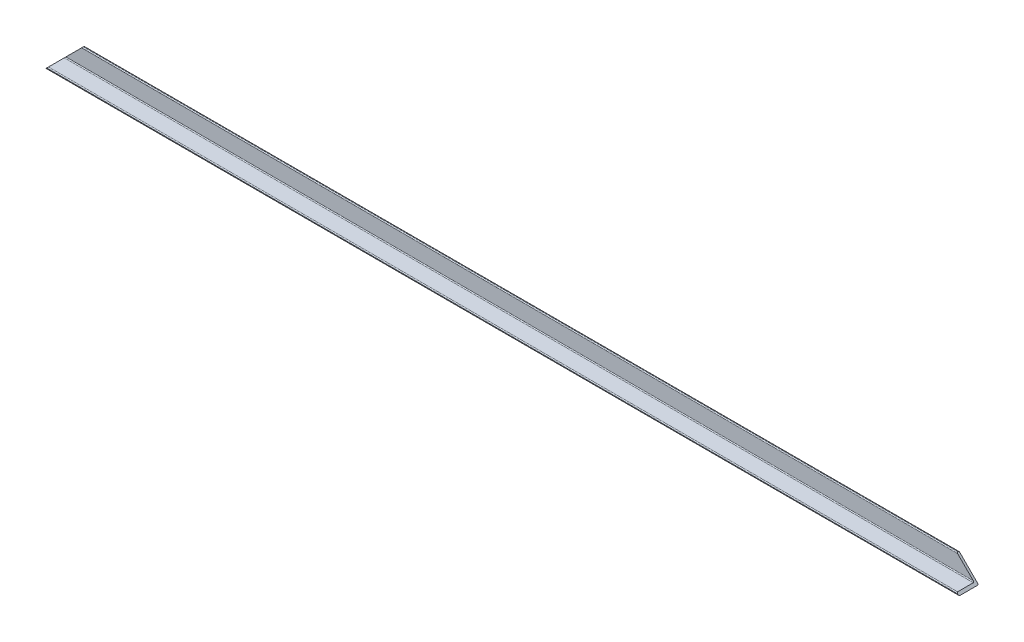
ISO-10303-21;
HEADER;
FILE_DESCRIPTION(('STEP AP214'),'2;1');
FILE_NAME('part.step','',(''),(''),'','','');
FILE_SCHEMA(('AUTOMOTIVE_DESIGN { 1 0 10303 214 1 1 1 1 }'));
ENDSEC;
DATA;
#1=APPLICATION_CONTEXT('core data for automotive mechanical design processes');
#2=APPLICATION_PROTOCOL_DEFINITION('international standard','automotive_design',2000,#1);
#3=PRODUCT_CONTEXT('',#1,'mechanical');
#4=PRODUCT('Part','Part','',(#3));
#5=PRODUCT_RELATED_PRODUCT_CATEGORY('part','',(#4));
#6=PRODUCT_DEFINITION_FORMATION('','',#4);
#7=PRODUCT_DEFINITION_CONTEXT('part definition',#1,'design');
#8=PRODUCT_DEFINITION('design','',#6,#7);
#9=PRODUCT_DEFINITION_SHAPE('','',#8);
#10=(LENGTH_UNIT() NAMED_UNIT(*) SI_UNIT(.MILLI.,.METRE.));
#11=(NAMED_UNIT(*) PLANE_ANGLE_UNIT() SI_UNIT($,.RADIAN.));
#12=(NAMED_UNIT(*) SI_UNIT($,.STERADIAN.) SOLID_ANGLE_UNIT());
#13=UNCERTAINTY_MEASURE_WITH_UNIT(LENGTH_MEASURE(1.E-05),#10,'distance_accuracy_value','');
#14=(GEOMETRIC_REPRESENTATION_CONTEXT(3) GLOBAL_UNCERTAINTY_ASSIGNED_CONTEXT((#13)) GLOBAL_UNIT_ASSIGNED_CONTEXT((#10,
#11,#12)) REPRESENTATION_CONTEXT('',''));
#15=CARTESIAN_POINT('',(0.,0.,0.));
#16=DIRECTION('',(0.,0.,1.));
#17=DIRECTION('',(1.,0.,0.));
#18=AXIS2_PLACEMENT_3D('',#15,#16,#17);
#19=CARTESIAN_POINT('',(-532.5,2.5,-11.25));
#20=DIRECTION('',(0.,0.,1.));
#21=DIRECTION('',(1.,0.,0.));
#22=AXIS2_PLACEMENT_3D('',#19,#20,#21);
#23=PLANE('',#22);
#24=DIRECTION('',(-0.707106781186541,0.707106781186554,0.));
#25=VECTOR('',#24,1.);
#26=CARTESIAN_POINT('',(-4.99999999999057,530.,-11.25));
#27=LINE('',#26,#25);
#28=CARTESIAN_POINT('',(524.,1.,-11.25));
#29=VERTEX_POINT('',#28);
#30=CARTESIAN_POINT('',(503.500000000001,21.5,-11.25));
#31=VERTEX_POINT('',#30);
#32=EDGE_CURVE('E126',#29,#31,#27,.T.);
#33=ORIENTED_EDGE('',*,*,#32,.F.);
#34=DIRECTION('',(-1.,0.,0.));
#35=VECTOR('',#34,1.);
#36=CARTESIAN_POINT('',(-532.5,1.,-11.25));
#37=LINE('',#36,#35);
#38=CARTESIAN_POINT('',(-524.,1.00000000000002,-11.25));
#39=VERTEX_POINT('',#38);
#40=EDGE_CURVE('E138',#29,#39,#37,.T.);
#41=ORIENTED_EDGE('',*,*,#40,.T.);
#42=DIRECTION('',(-0.707106781186544,-0.707106781186551,0.));
#43=VECTOR('',#42,1.);
#44=CARTESIAN_POINT('',(-527.5,-2.49999999999995,-11.25));
#45=LINE('',#44,#43);
#46=CARTESIAN_POINT('',(-503.5,21.5,-11.25));
#47=VERTEX_POINT('',#46);
#48=EDGE_CURVE('E221',#47,#39,#45,.T.);
#49=ORIENTED_EDGE('',*,*,#48,.F.);
#50=DIRECTION('',(-1.,0.,0.));
#51=VECTOR('',#50,1.);
#52=CARTESIAN_POINT('',(502.5,21.5,-11.25));
#53=LINE('',#52,#51);
#54=EDGE_CURVE('E141',#47,#31,#53,.F.);
#55=ORIENTED_EDGE('',*,*,#54,.T.);
#56=EDGE_LOOP('',(#33,#41,#49,#55));
#57=FACE_BOUND('',#56,.T.);
#58=ADVANCED_FACE('F33',(#57),#23,.F.);
#59=CARTESIAN_POINT('',(-532.5,2.5,11.25));
#60=DIRECTION('',(0.,0.,-1.));
#61=DIRECTION('',(-1.,0.,0.));
#62=AXIS2_PLACEMENT_3D('',#59,#60,#61);
#63=PLANE('',#62);
#64=DIRECTION('',(0.707106781186544,0.707106781186551,0.));
#65=VECTOR('',#64,1.);
#66=CARTESIAN_POINT('',(-532.5,-7.5,11.25));
#67=LINE('',#66,#65);
#68=CARTESIAN_POINT('',(-524.,1.00000000000002,11.25));
#69=VERTEX_POINT('',#68);
#70=CARTESIAN_POINT('',(-523.5,1.49999999999999,11.25));
#71=VERTEX_POINT('',#70);
#72=EDGE_CURVE('E142',#69,#71,#67,.T.);
#73=ORIENTED_EDGE('',*,*,#72,.F.);
#74=DIRECTION('',(1.,0.,0.));
#75=VECTOR('',#74,1.);
#76=CARTESIAN_POINT('',(-532.5,1.,11.25));
#77=LINE('',#76,#75);
#78=CARTESIAN_POINT('',(524.,0.999999999999994,11.25));
#79=VERTEX_POINT('',#78);
#80=EDGE_CURVE('E171',#69,#79,#77,.T.);
#81=ORIENTED_EDGE('',*,*,#80,.T.);
#82=DIRECTION('',(0.707106781186541,-0.707106781186554,0.));
#83=VECTOR('',#82,1.);
#84=CARTESIAN_POINT('',(532.5,-7.5,11.25));
#85=LINE('',#84,#83);
#86=CARTESIAN_POINT('',(523.5,1.50000000000003,11.25));
#87=VERTEX_POINT('',#86);
#88=EDGE_CURVE('E234',#87,#79,#85,.T.);
#89=ORIENTED_EDGE('',*,*,#88,.F.);
#90=DIRECTION('',(1.,0.,0.));
#91=VECTOR('',#90,1.);
#92=CARTESIAN_POINT('',(-522.5,1.5,11.25));
#93=LINE('',#92,#91);
#94=EDGE_CURVE('E133',#87,#71,#93,.F.);
#95=ORIENTED_EDGE('',*,*,#94,.T.);
#96=EDGE_LOOP('',(#73,#81,#89,#95));
#97=FACE_BOUND('',#96,.T.);
#98=ADVANCED_FACE('F241',(#97),#63,.F.);
#99=CARTESIAN_POINT('',(0.,2.5,0.));
#100=DIRECTION('',(0.,1.,0.));
#101=DIRECTION('',(0.,0.,1.));
#102=AXIS2_PLACEMENT_3D('',#99,#100,#101);
#103=PLANE('',#102);
#104=DIRECTION('',(0.,0.,1.));
#105=VECTOR('',#104,1.);
#106=CARTESIAN_POINT('',(-522.5,2.5,0.));
#107=LINE('',#106,#105);
#108=CARTESIAN_POINT('',(-522.5,2.5,-7.75));
#109=VERTEX_POINT('',#108);
#110=CARTESIAN_POINT('',(-522.5,2.5,10.25));
#111=VERTEX_POINT('',#110);
#112=EDGE_CURVE('E209',#109,#111,#107,.T.);
#113=ORIENTED_EDGE('',*,*,#112,.T.);
#114=DIRECTION('',(1.,0.,0.));
#115=VECTOR('',#114,1.);
#116=CARTESIAN_POINT('',(522.5,2.5,10.25));
#117=LINE('',#116,#115);
#118=CARTESIAN_POINT('',(522.5,2.5,10.25));
#119=VERTEX_POINT('',#118);
#120=EDGE_CURVE('E175',#111,#119,#117,.T.);
#121=ORIENTED_EDGE('',*,*,#120,.T.);
#122=DIRECTION('',(0.,0.,-1.));
#123=VECTOR('',#122,1.);
#124=CARTESIAN_POINT('',(522.5,2.5,0.));
#125=LINE('',#124,#123);
#126=CARTESIAN_POINT('',(522.5,2.5,-7.75));
#127=VERTEX_POINT('',#126);
#128=EDGE_CURVE('E190',#119,#127,#125,.T.);
#129=ORIENTED_EDGE('',*,*,#128,.T.);
#130=DIRECTION('',(1.,0.,0.));
#131=VECTOR('',#130,1.);
#132=CARTESIAN_POINT('',(0.,2.5,-7.75));
#133=LINE('',#132,#131);
#134=EDGE_CURVE('E173',#127,#109,#133,.F.);
#135=ORIENTED_EDGE('',*,*,#134,.T.);
#136=EDGE_LOOP('',(#113,#121,#129,#135));
#137=FACE_BOUND('',#136,.T.);
#138=ADVANCED_FACE('F198',(#137),#103,.T.);
#139=CARTESIAN_POINT('',(0.,0.,0.));
#140=DIRECTION('',(0.,1.,0.));
#141=DIRECTION('',(0.,0.,1.));
#142=AXIS2_PLACEMENT_3D('',#139,#140,#141);
#143=PLANE('',#142);
#144=DIRECTION('',(0.,0.,1.));
#145=VECTOR('',#144,1.);
#146=CARTESIAN_POINT('',(-525.,0.,0.));
#147=LINE('',#146,#145);
#148=CARTESIAN_POINT('',(-525.,0.,-10.25));
#149=VERTEX_POINT('',#148);
#150=CARTESIAN_POINT('',(-525.,0.,10.25));
#151=VERTEX_POINT('',#150);
#152=EDGE_CURVE('E214',#149,#151,#147,.T.);
#153=ORIENTED_EDGE('',*,*,#152,.F.);
#154=DIRECTION('',(-1.,0.,0.));
#155=VECTOR('',#154,1.);
#156=CARTESIAN_POINT('',(0.,0.,-10.25));
#157=LINE('',#156,#155);
#158=CARTESIAN_POINT('',(525.,0.,-10.25));
#159=VERTEX_POINT('',#158);
#160=EDGE_CURVE('E162',#149,#159,#157,.F.);
#161=ORIENTED_EDGE('',*,*,#160,.T.);
#162=DIRECTION('',(0.,0.,-1.));
#163=VECTOR('',#162,1.);
#164=CARTESIAN_POINT('',(525.,0.,0.));
#165=LINE('',#164,#163);
#166=CARTESIAN_POINT('',(525.,0.,10.25));
#167=VERTEX_POINT('',#166);
#168=EDGE_CURVE('E129',#167,#159,#165,.T.);
#169=ORIENTED_EDGE('',*,*,#168,.F.);
#170=DIRECTION('',(1.,0.,0.));
#171=VECTOR('',#170,1.);
#172=CARTESIAN_POINT('',(0.,0.,10.25));
#173=LINE('',#172,#171);
#174=EDGE_CURVE('E160',#167,#151,#173,.F.);
#175=ORIENTED_EDGE('',*,*,#174,.T.);
#176=EDGE_LOOP('',(#153,#161,#169,#175));
#177=FACE_BOUND('',#176,.T.);
#178=ADVANCED_FACE('F249',(#177),#143,.F.);
#179=CARTESIAN_POINT('',(-532.5,22.5,-8.75));
#180=DIRECTION('',(0.,0.,-1.));
#181=DIRECTION('',(-1.,0.,0.));
#182=AXIS2_PLACEMENT_3D('',#179,#180,#181);
#183=PLANE('',#182);
#184=DIRECTION('',(0.707106781186541,-0.707106781186554,0.));
#185=VECTOR('',#184,1.);
#186=CARTESIAN_POINT('',(-14.9999999999906,540.,-8.75));
#187=LINE('',#186,#185);
#188=CARTESIAN_POINT('',(503.5,21.5,-8.75));
#189=VERTEX_POINT('',#188);
#190=CARTESIAN_POINT('',(521.5,3.49999999999995,-8.75));
#191=VERTEX_POINT('',#190);
#192=EDGE_CURVE('E192',#189,#191,#187,.T.);
#193=ORIENTED_EDGE('',*,*,#192,.F.);
#194=DIRECTION('',(1.,0.,0.));
#195=VECTOR('',#194,1.);
#196=CARTESIAN_POINT('',(-502.5,21.5,-8.75));
#197=LINE('',#196,#195);
#198=CARTESIAN_POINT('',(-503.5,21.5,-8.75));
#199=VERTEX_POINT('',#198);
#200=EDGE_CURVE('E187',#189,#199,#197,.F.);
#201=ORIENTED_EDGE('',*,*,#200,.T.);
#202=DIRECTION('',(0.707106781186544,0.707106781186551,0.));
#203=VECTOR('',#202,1.);
#204=CARTESIAN_POINT('',(-517.5,7.50000000000015,-8.75));
#205=LINE('',#204,#203);
#206=CARTESIAN_POINT('',(-521.5,3.5,-8.75));
#207=VERTEX_POINT('',#206);
#208=EDGE_CURVE('E207',#207,#199,#205,.T.);
#209=ORIENTED_EDGE('',*,*,#208,.F.);
#210=DIRECTION('',(1.,0.,0.));
#211=VECTOR('',#210,1.);
#212=CARTESIAN_POINT('',(-532.5,3.5,-8.75));
#213=LINE('',#212,#211);
#214=EDGE_CURVE('E184',#207,#191,#213,.T.);
#215=ORIENTED_EDGE('',*,*,#214,.T.);
#216=EDGE_LOOP('',(#193,#201,#209,#215));
#217=FACE_BOUND('',#216,.T.);
#218=ADVANCED_FACE('F211',(#217),#183,.F.);
#219=CARTESIAN_POINT('',(0.,22.5,0.));
#220=DIRECTION('',(0.,1.,0.));
#221=DIRECTION('',(0.,0.,1.));
#222=AXIS2_PLACEMENT_3D('',#219,#220,#221);
#223=PLANE('',#222);
#224=DIRECTION('',(0.,0.,-1.));
#225=VECTOR('',#224,1.);
#226=CARTESIAN_POINT('',(502.5,22.5,11.25));
#227=LINE('',#226,#225);
#228=CARTESIAN_POINT('',(502.5,22.5,-9.75));
#229=VERTEX_POINT('',#228);
#230=CARTESIAN_POINT('',(502.5,22.5,-10.25));
#231=VERTEX_POINT('',#230);
#232=EDGE_CURVE('E232',#229,#231,#227,.T.);
#233=ORIENTED_EDGE('',*,*,#232,.T.);
#234=DIRECTION('',(-1.,0.,0.));
#235=VECTOR('',#234,1.);
#236=CARTESIAN_POINT('',(-502.5,22.5,-10.25));
#237=LINE('',#236,#235);
#238=CARTESIAN_POINT('',(-502.5,22.5,-10.25));
#239=VERTEX_POINT('',#238);
#240=EDGE_CURVE('E181',#231,#239,#237,.T.);
#241=ORIENTED_EDGE('',*,*,#240,.T.);
#242=DIRECTION('',(0.,0.,1.));
#243=VECTOR('',#242,1.);
#244=CARTESIAN_POINT('',(-502.5,22.5,0.));
#245=LINE('',#244,#243);
#246=CARTESIAN_POINT('',(-502.5,22.5,-9.75));
#247=VERTEX_POINT('',#246);
#248=EDGE_CURVE('E150',#239,#247,#245,.T.);
#249=ORIENTED_EDGE('',*,*,#248,.T.);
#250=DIRECTION('',(1.,0.,0.));
#251=VECTOR('',#250,1.);
#252=CARTESIAN_POINT('',(502.5,22.5,-9.75));
#253=LINE('',#252,#251);
#254=EDGE_CURVE('E178',#247,#229,#253,.T.);
#255=ORIENTED_EDGE('',*,*,#254,.T.);
#256=EDGE_LOOP('',(#233,#241,#249,#255));
#257=FACE_BOUND('',#256,.T.);
#258=ADVANCED_FACE('F227',(#257),#223,.T.);
#259=CARTESIAN_POINT('',(-532.5,-7.5,11.25));
#260=DIRECTION('',(-0.707106781186551,0.707106781186544,0.));
#261=DIRECTION('',(-0.707106781186544,-0.707106781186551,0.));
#262=AXIS2_PLACEMENT_3D('',#259,#260,#261);
#263=PLANE('',#262);
#264=ORIENTED_EDGE('',*,*,#48,.T.);
#265=CARTESIAN_POINT('',(-524.,1.,-10.25));
#266=DIRECTION('',(-0.707106781186551,0.707106781186544,0.));
#267=DIRECTION('',(-0.707106781186544,-0.707106781186551,0.));
#268=AXIS2_PLACEMENT_3D('',#265,#266,#267);
#269=ELLIPSE('',#268,1.41421356237309,1.);
#270=EDGE_CURVE('E145',#39,#149,#269,.T.);
#271=ORIENTED_EDGE('',*,*,#270,.T.);
#272=ORIENTED_EDGE('',*,*,#152,.T.);
#273=CARTESIAN_POINT('',(-524.,1.,10.25));
#274=DIRECTION('',(-0.707106781186551,0.707106781186544,0.));
#275=DIRECTION('',(0.707106781186544,0.707106781186551,0.));
#276=AXIS2_PLACEMENT_3D('',#273,#274,#275);
#277=ELLIPSE('',#276,1.41421356237309,1.);
#278=EDGE_CURVE('E157',#151,#69,#277,.T.);
#279=ORIENTED_EDGE('',*,*,#278,.T.);
#280=ORIENTED_EDGE('',*,*,#72,.T.);
#281=CARTESIAN_POINT('',(-523.5,1.5,10.25));
#282=DIRECTION('',(-0.707106781186551,0.707106781186544,0.));
#283=DIRECTION('',(-0.707106781186544,-0.707106781186551,0.));
#284=AXIS2_PLACEMENT_3D('',#281,#282,#283);
#285=ELLIPSE('',#284,1.41421356237309,1.);
#286=EDGE_CURVE('E155',#71,#111,#285,.T.);
#287=ORIENTED_EDGE('',*,*,#286,.T.);
#288=ORIENTED_EDGE('',*,*,#112,.F.);
#289=CARTESIAN_POINT('',(-521.5,3.5,-7.75));
#290=DIRECTION('',(-0.707106781186551,0.707106781186544,0.));
#291=DIRECTION('',(0.707106781186544,0.707106781186551,0.));
#292=AXIS2_PLACEMENT_3D('',#289,#290,#291);
#293=ELLIPSE('',#292,1.41421356237309,1.);
#294=EDGE_CURVE('E11',#109,#207,#293,.F.);
#295=ORIENTED_EDGE('',*,*,#294,.T.);
#296=ORIENTED_EDGE('',*,*,#208,.T.);
#297=CARTESIAN_POINT('',(-503.5,21.5,-9.75));
#298=DIRECTION('',(-0.707106781186551,0.707106781186544,0.));
#299=DIRECTION('',(-0.707106781186544,-0.707106781186551,0.));
#300=AXIS2_PLACEMENT_3D('',#297,#298,#299);
#301=ELLIPSE('',#300,1.41421356237309,1.);
#302=EDGE_CURVE('E146',#199,#247,#301,.T.);
#303=ORIENTED_EDGE('',*,*,#302,.T.);
#304=ORIENTED_EDGE('',*,*,#248,.F.);
#305=CARTESIAN_POINT('',(-503.5,21.5,-10.25));
#306=DIRECTION('',(-0.707106781186551,0.707106781186544,0.));
#307=DIRECTION('',(0.707106781186544,0.707106781186551,0.));
#308=AXIS2_PLACEMENT_3D('',#305,#306,#307);
#309=ELLIPSE('',#308,1.41421356237309,1.);
#310=EDGE_CURVE('E148',#239,#47,#309,.T.);
#311=ORIENTED_EDGE('',*,*,#310,.T.);
#312=EDGE_LOOP('',(#264,#271,#272,#279,#280,#287,#288,#295,#296,#303,#304,#311));
#313=FACE_BOUND('',#312,.T.);
#314=ADVANCED_FACE('F206',(#313),#263,.T.);
#315=CARTESIAN_POINT('',(532.5,-7.5,11.25));
#316=DIRECTION('',(0.707106781186554,0.707106781186541,0.));
#317=DIRECTION('',(-0.707106781186541,0.707106781186554,0.));
#318=AXIS2_PLACEMENT_3D('',#315,#316,#317);
#319=PLANE('',#318);
#320=ORIENTED_EDGE('',*,*,#168,.T.);
#321=CARTESIAN_POINT('',(524.,1.,-10.25));
#322=DIRECTION('',(0.707106781186554,0.707106781186541,0.));
#323=DIRECTION('',(-0.707106781186541,0.707106781186554,0.));
#324=AXIS2_PLACEMENT_3D('',#321,#322,#323);
#325=ELLIPSE('',#324,1.41421356237308,1.);
#326=EDGE_CURVE('E123',#159,#29,#325,.T.);
#327=ORIENTED_EDGE('',*,*,#326,.T.);
#328=ORIENTED_EDGE('',*,*,#32,.T.);
#329=CARTESIAN_POINT('',(503.5,21.5,-10.25));
#330=DIRECTION('',(0.707106781186554,0.707106781186541,0.));
#331=DIRECTION('',(0.707106781186541,-0.707106781186554,0.));
#332=AXIS2_PLACEMENT_3D('',#329,#330,#331);
#333=ELLIPSE('',#332,1.41421356237308,1.);
#334=EDGE_CURVE('E166',#31,#231,#333,.T.);
#335=ORIENTED_EDGE('',*,*,#334,.T.);
#336=ORIENTED_EDGE('',*,*,#232,.F.);
#337=CARTESIAN_POINT('',(503.5,21.5,-9.75));
#338=DIRECTION('',(0.707106781186554,0.707106781186541,0.));
#339=DIRECTION('',(-0.707106781186541,0.707106781186554,0.));
#340=AXIS2_PLACEMENT_3D('',#337,#338,#339);
#341=ELLIPSE('',#340,1.41421356237308,1.);
#342=EDGE_CURVE('E164',#229,#189,#341,.T.);
#343=ORIENTED_EDGE('',*,*,#342,.T.);
#344=ORIENTED_EDGE('',*,*,#192,.T.);
#345=CARTESIAN_POINT('',(521.5,3.5,-7.75));
#346=DIRECTION('',(0.707106781186554,0.707106781186541,0.));
#347=DIRECTION('',(0.707106781186541,-0.707106781186554,0.));
#348=AXIS2_PLACEMENT_3D('',#345,#346,#347);
#349=ELLIPSE('',#348,1.41421356237308,1.);
#350=EDGE_CURVE('E41',#191,#127,#349,.F.);
#351=ORIENTED_EDGE('',*,*,#350,.T.);
#352=ORIENTED_EDGE('',*,*,#128,.F.);
#353=CARTESIAN_POINT('',(523.5,1.5,10.25));
#354=DIRECTION('',(0.707106781186554,0.707106781186541,0.));
#355=DIRECTION('',(-0.707106781186541,0.707106781186554,0.));
#356=AXIS2_PLACEMENT_3D('',#353,#354,#355);
#357=ELLIPSE('',#356,1.41421356237308,1.);
#358=EDGE_CURVE('E56',#119,#87,#357,.T.);
#359=ORIENTED_EDGE('',*,*,#358,.T.);
#360=ORIENTED_EDGE('',*,*,#88,.T.);
#361=CARTESIAN_POINT('',(524.,1.,10.25));
#362=DIRECTION('',(0.707106781186554,0.707106781186541,0.));
#363=DIRECTION('',(0.707106781186541,-0.707106781186554,0.));
#364=AXIS2_PLACEMENT_3D('',#361,#362,#363);
#365=ELLIPSE('',#364,1.41421356237308,1.);
#366=EDGE_CURVE('E48',#79,#167,#365,.T.);
#367=ORIENTED_EDGE('',*,*,#366,.T.);
#368=EDGE_LOOP('',(#320,#327,#328,#335,#336,#343,#344,#351,#352,#359,#360,#367));
#369=FACE_BOUND('',#368,.T.);
#370=ADVANCED_FACE('F125',(#369),#319,.T.);
#371=CARTESIAN_POINT('',(-532.5,1.,-10.25));
#372=DIRECTION('',(-1.,0.,0.));
#373=DIRECTION('',(0.,0.,1.));
#374=AXIS2_PLACEMENT_3D('',#371,#372,#373);
#375=CYLINDRICAL_SURFACE('',#374,1.);
#376=ORIENTED_EDGE('',*,*,#326,.F.);
#377=ORIENTED_EDGE('',*,*,#160,.F.);
#378=ORIENTED_EDGE('',*,*,#270,.F.);
#379=ORIENTED_EDGE('',*,*,#40,.F.);
#380=EDGE_LOOP('',(#376,#377,#378,#379));
#381=FACE_BOUND('',#380,.T.);
#382=ADVANCED_FACE('F144',(#381),#375,.T.);
#383=CARTESIAN_POINT('',(-532.5,1.,10.25));
#384=DIRECTION('',(1.,0.,0.));
#385=DIRECTION('',(0.,0.,-1.));
#386=AXIS2_PLACEMENT_3D('',#383,#384,#385);
#387=CYLINDRICAL_SURFACE('',#386,1.);
#388=ORIENTED_EDGE('',*,*,#278,.F.);
#389=ORIENTED_EDGE('',*,*,#174,.F.);
#390=ORIENTED_EDGE('',*,*,#366,.F.);
#391=ORIENTED_EDGE('',*,*,#80,.F.);
#392=EDGE_LOOP('',(#388,#389,#390,#391));
#393=FACE_BOUND('',#392,.T.);
#394=ADVANCED_FACE('F246',(#393),#387,.T.);
#395=CARTESIAN_POINT('',(0.,1.5,10.25));
#396=DIRECTION('',(-1.,0.,0.));
#397=DIRECTION('',(0.,0.,1.));
#398=AXIS2_PLACEMENT_3D('',#395,#396,#397);
#399=CYLINDRICAL_SURFACE('',#398,1.);
#400=ORIENTED_EDGE('',*,*,#286,.F.);
#401=ORIENTED_EDGE('',*,*,#94,.F.);
#402=ORIENTED_EDGE('',*,*,#358,.F.);
#403=ORIENTED_EDGE('',*,*,#120,.F.);
#404=EDGE_LOOP('',(#400,#401,#402,#403));
#405=FACE_BOUND('',#404,.T.);
#406=ADVANCED_FACE('F244',(#405),#399,.T.);
#407=CARTESIAN_POINT('',(0.,21.5,-10.25));
#408=DIRECTION('',(1.,0.,0.));
#409=DIRECTION('',(0.,0.,-1.));
#410=AXIS2_PLACEMENT_3D('',#407,#408,#409);
#411=CYLINDRICAL_SURFACE('',#410,1.);
#412=ORIENTED_EDGE('',*,*,#334,.F.);
#413=ORIENTED_EDGE('',*,*,#54,.F.);
#414=ORIENTED_EDGE('',*,*,#310,.F.);
#415=ORIENTED_EDGE('',*,*,#240,.F.);
#416=EDGE_LOOP('',(#412,#413,#414,#415));
#417=FACE_BOUND('',#416,.T.);
#418=ADVANCED_FACE('F251',(#417),#411,.T.);
#419=CARTESIAN_POINT('',(0.,21.5,-9.75));
#420=DIRECTION('',(-1.,0.,0.));
#421=DIRECTION('',(0.,0.,1.));
#422=AXIS2_PLACEMENT_3D('',#419,#420,#421);
#423=CYLINDRICAL_SURFACE('',#422,1.);
#424=ORIENTED_EDGE('',*,*,#302,.F.);
#425=ORIENTED_EDGE('',*,*,#200,.F.);
#426=ORIENTED_EDGE('',*,*,#342,.F.);
#427=ORIENTED_EDGE('',*,*,#254,.F.);
#428=EDGE_LOOP('',(#424,#425,#426,#427));
#429=FACE_BOUND('',#428,.T.);
#430=ADVANCED_FACE('F231',(#429),#423,.T.);
#431=CARTESIAN_POINT('',(-532.5,3.5,-7.75));
#432=DIRECTION('',(1.,0.,0.));
#433=DIRECTION('',(0.,0.,-1.));
#434=AXIS2_PLACEMENT_3D('',#431,#432,#433);
#435=CYLINDRICAL_SURFACE('',#434,1.);
#436=ORIENTED_EDGE('',*,*,#294,.F.);
#437=ORIENTED_EDGE('',*,*,#134,.F.);
#438=ORIENTED_EDGE('',*,*,#350,.F.);
#439=ORIENTED_EDGE('',*,*,#214,.F.);
#440=EDGE_LOOP('',(#436,#437,#438,#439));
#441=FACE_BOUND('',#440,.T.);
#442=ADVANCED_FACE('F35',(#441),#435,.F.);
#443=CLOSED_SHELL('',(#58,#98,#138,#178,#218,#258,#314,#370,#382,#394,#406,#418,#430,#442));
#444=MANIFOLD_SOLID_BREP('B2',#443);
#445=ADVANCED_BREP_SHAPE_REPRESENTATION('',(#18,#444),#14);
#446=SHAPE_DEFINITION_REPRESENTATION(#9,#445);
ENDSEC;
END-ISO-10303-21;
